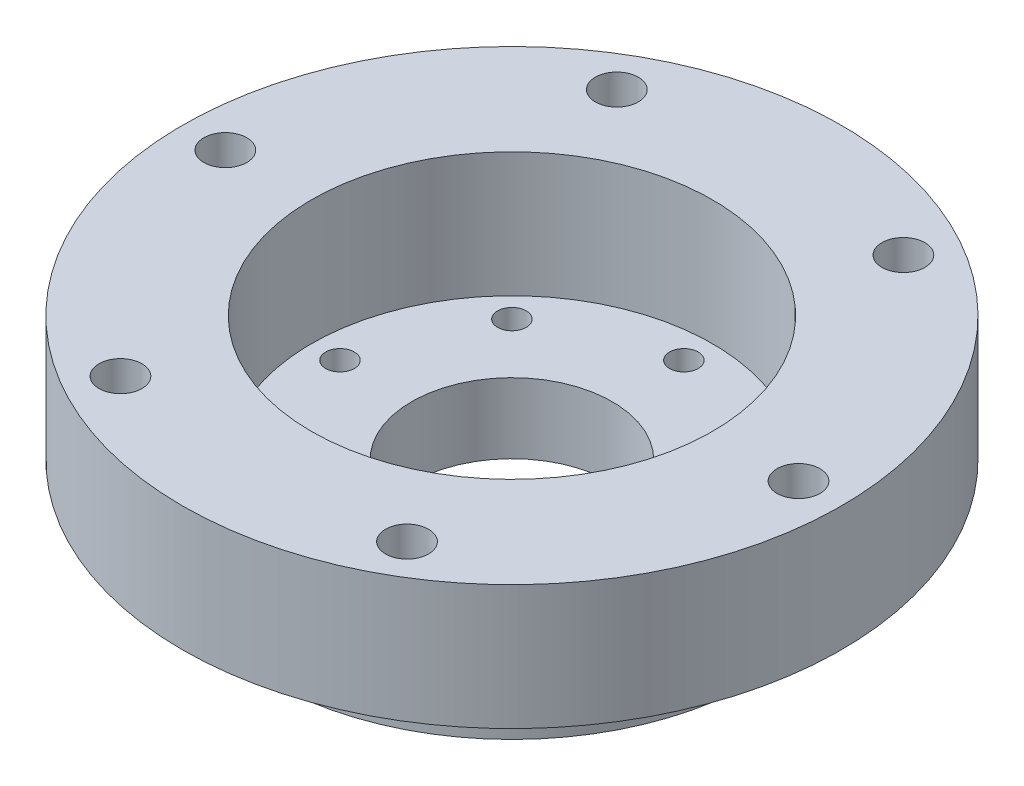
ISO-10303-21;
HEADER;
FILE_DESCRIPTION(('STEP AP214'),'2;1');
FILE_NAME('part.step','',(''),(''),'','','');
FILE_SCHEMA(('AUTOMOTIVE_DESIGN { 1 0 10303 214 1 1 1 1 }'));
ENDSEC;
DATA;
#1=APPLICATION_CONTEXT('core data for automotive mechanical design processes');
#2=APPLICATION_PROTOCOL_DEFINITION('international standard','automotive_design',2000,#1);
#3=PRODUCT_CONTEXT('',#1,'mechanical');
#4=PRODUCT('Part','Part','',(#3));
#5=PRODUCT_RELATED_PRODUCT_CATEGORY('part','',(#4));
#6=PRODUCT_DEFINITION_FORMATION('','',#4);
#7=PRODUCT_DEFINITION_CONTEXT('part definition',#1,'design');
#8=PRODUCT_DEFINITION('design','',#6,#7);
#9=PRODUCT_DEFINITION_SHAPE('','',#8);
#10=(LENGTH_UNIT() NAMED_UNIT(*) SI_UNIT(.MILLI.,.METRE.));
#11=(NAMED_UNIT(*) PLANE_ANGLE_UNIT() SI_UNIT($,.RADIAN.));
#12=(NAMED_UNIT(*) SI_UNIT($,.STERADIAN.) SOLID_ANGLE_UNIT());
#13=UNCERTAINTY_MEASURE_WITH_UNIT(LENGTH_MEASURE(1.E-05),#10,'distance_accuracy_value','');
#14=(GEOMETRIC_REPRESENTATION_CONTEXT(3) GLOBAL_UNCERTAINTY_ASSIGNED_CONTEXT((#13)) GLOBAL_UNIT_ASSIGNED_CONTEXT((#10,
#11,#12)) REPRESENTATION_CONTEXT('',''));
#15=CARTESIAN_POINT('',(0.,0.,0.));
#16=DIRECTION('',(0.,0.,1.));
#17=DIRECTION('',(1.,0.,0.));
#18=AXIS2_PLACEMENT_3D('',#15,#16,#17);
#19=CARTESIAN_POINT('',(0.,4.9,0.));
#20=DIRECTION('',(0.,1.,0.));
#21=DIRECTION('',(0.,0.,1.));
#22=AXIS2_PLACEMENT_3D('',#19,#20,#21);
#23=PLANE('',#22);
#24=CARTESIAN_POINT('',(-8.48528137423858,4.9,-8.48528137423856));
#25=DIRECTION('',(0.,1.,0.));
#26=DIRECTION('',(0.,0.,1.));
#27=AXIS2_PLACEMENT_3D('',#24,#25,#26);
#28=CIRCLE('',#27,1.);
#29=CARTESIAN_POINT('',(-8.48528137423858,4.9,-7.48528137423855));
#30=VERTEX_POINT('',#29);
#31=EDGE_CURVE('E51',#30,#30,#28,.F.);
#32=ORIENTED_EDGE('',*,*,#31,.T.);
#33=EDGE_LOOP('',(#32));
#34=FACE_BOUND('',#33,.T.);
#35=CARTESIAN_POINT('',(-8.48528137423858,4.9,8.48528137423856));
#36=DIRECTION('',(0.,1.,0.));
#37=DIRECTION('',(0.,0.,1.));
#38=AXIS2_PLACEMENT_3D('',#35,#36,#37);
#39=CIRCLE('',#38,1.);
#40=CARTESIAN_POINT('',(-8.48528137423858,4.9,9.48528137423856));
#41=VERTEX_POINT('',#40);
#42=EDGE_CURVE('E56',#41,#41,#39,.T.);
#43=ORIENTED_EDGE('',*,*,#42,.F.);
#44=EDGE_LOOP('',(#43));
#45=FACE_BOUND('',#44,.T.);
#46=CARTESIAN_POINT('',(-12.,4.9,0.));
#47=DIRECTION('',(0.,1.,0.));
#48=DIRECTION('',(0.,0.,1.));
#49=AXIS2_PLACEMENT_3D('',#46,#47,#48);
#50=CIRCLE('',#49,1.);
#51=CARTESIAN_POINT('',(-12.,4.9,1.));
#52=VERTEX_POINT('',#51);
#53=EDGE_CURVE('E62',#52,#52,#50,.F.);
#54=ORIENTED_EDGE('',*,*,#53,.T.);
#55=EDGE_LOOP('',(#54));
#56=FACE_BOUND('',#55,.T.);
#57=CARTESIAN_POINT('',(0.,4.9,0.));
#58=DIRECTION('',(0.,1.,0.));
#59=DIRECTION('',(0.,0.,1.));
#60=AXIS2_PLACEMENT_3D('',#57,#58,#59);
#61=CIRCLE('',#60,7.);
#62=CARTESIAN_POINT('',(0.,4.9,7.));
#63=VERTEX_POINT('',#62);
#64=EDGE_CURVE('E132',#63,#63,#61,.T.);
#65=ORIENTED_EDGE('',*,*,#64,.F.);
#66=EDGE_LOOP('',(#65));
#67=FACE_BOUND('',#66,.T.);
#68=CARTESIAN_POINT('',(0.,4.9,-12.));
#69=DIRECTION('',(0.,1.,0.));
#70=DIRECTION('',(0.,0.,1.));
#71=AXIS2_PLACEMENT_3D('',#68,#69,#70);
#72=CIRCLE('',#71,1.);
#73=CARTESIAN_POINT('',(0.,4.9,-11.));
#74=VERTEX_POINT('',#73);
#75=EDGE_CURVE('E128',#74,#74,#72,.T.);
#76=ORIENTED_EDGE('',*,*,#75,.F.);
#77=EDGE_LOOP('',(#76));
#78=FACE_BOUND('',#77,.T.);
#79=CARTESIAN_POINT('',(12.,4.9,0.));
#80=DIRECTION('',(0.,1.,0.));
#81=DIRECTION('',(0.,0.,1.));
#82=AXIS2_PLACEMENT_3D('',#79,#80,#81);
#83=CIRCLE('',#82,1.);
#84=CARTESIAN_POINT('',(12.,4.9,1.));
#85=VERTEX_POINT('',#84);
#86=EDGE_CURVE('E124',#85,#85,#83,.T.);
#87=ORIENTED_EDGE('',*,*,#86,.F.);
#88=EDGE_LOOP('',(#87));
#89=FACE_BOUND('',#88,.T.);
#90=CARTESIAN_POINT('',(0.,4.9,12.));
#91=DIRECTION('',(0.,1.,0.));
#92=DIRECTION('',(0.,0.,1.));
#93=AXIS2_PLACEMENT_3D('',#90,#91,#92);
#94=CIRCLE('',#93,1.);
#95=CARTESIAN_POINT('',(0.,4.9,13.));
#96=VERTEX_POINT('',#95);
#97=EDGE_CURVE('E116',#96,#96,#94,.F.);
#98=ORIENTED_EDGE('',*,*,#97,.T.);
#99=EDGE_LOOP('',(#98));
#100=FACE_BOUND('',#99,.T.);
#101=CARTESIAN_POINT('',(8.48528137423858,4.9,-8.48528137423856));
#102=DIRECTION('',(0.,1.,0.));
#103=DIRECTION('',(0.,0.,1.));
#104=AXIS2_PLACEMENT_3D('',#101,#102,#103);
#105=CIRCLE('',#104,1.);
#106=CARTESIAN_POINT('',(8.48528137423858,4.9,-7.48528137423855));
#107=VERTEX_POINT('',#106);
#108=EDGE_CURVE('E110',#107,#107,#105,.T.);
#109=ORIENTED_EDGE('',*,*,#108,.F.);
#110=EDGE_LOOP('',(#109));
#111=FACE_BOUND('',#110,.T.);
#112=CARTESIAN_POINT('',(8.48528137423858,4.9,8.48528137423856));
#113=DIRECTION('',(0.,1.,0.));
#114=DIRECTION('',(0.,0.,1.));
#115=AXIS2_PLACEMENT_3D('',#112,#113,#114);
#116=CIRCLE('',#115,1.);
#117=CARTESIAN_POINT('',(8.48528137423858,4.9,9.48528137423856));
#118=VERTEX_POINT('',#117);
#119=EDGE_CURVE('E105',#118,#118,#116,.F.);
#120=ORIENTED_EDGE('',*,*,#119,.T.);
#121=EDGE_LOOP('',(#120));
#122=FACE_BOUND('',#121,.T.);
#123=CARTESIAN_POINT('',(0.,4.9,0.));
#124=DIRECTION('',(0.,1.,0.));
#125=DIRECTION('',(0.,0.,1.));
#126=AXIS2_PLACEMENT_3D('',#123,#124,#125);
#127=CIRCLE('',#126,14.);
#128=CARTESIAN_POINT('',(0.,4.9,14.));
#129=VERTEX_POINT('',#128);
#130=EDGE_CURVE('E10',#129,#129,#127,.F.);
#131=ORIENTED_EDGE('',*,*,#130,.F.);
#132=EDGE_LOOP('',(#131));
#133=FACE_BOUND('',#132,.T.);
#134=ADVANCED_FACE('F43',(#34,#45,#56,#67,#78,#89,#100,#111,#122,#133),#23,.T.);
#135=CARTESIAN_POINT('',(-8.48528137423858,4.9,8.48528137423856));
#136=DIRECTION('',(0.,-1.,0.));
#137=DIRECTION('',(0.,0.,-1.));
#138=AXIS2_PLACEMENT_3D('',#135,#136,#137);
#139=CYLINDRICAL_SURFACE('',#138,1.);
#140=ORIENTED_EDGE('',*,*,#42,.T.);
#141=EDGE_LOOP('',(#140));
#142=FACE_BOUND('',#141,.T.);
#143=CARTESIAN_POINT('',(-8.48528137423858,0.,8.48528137423856));
#144=DIRECTION('',(0.,1.,0.));
#145=DIRECTION('',(0.,0.,1.));
#146=AXIS2_PLACEMENT_3D('',#143,#144,#145);
#147=CIRCLE('',#146,1.);
#148=CARTESIAN_POINT('',(-8.48528137423858,0.,9.48528137423856));
#149=VERTEX_POINT('',#148);
#150=EDGE_CURVE('E99',#149,#149,#147,.T.);
#151=ORIENTED_EDGE('',*,*,#150,.F.);
#152=EDGE_LOOP('',(#151));
#153=FACE_BOUND('',#152,.T.);
#154=ADVANCED_FACE('F149',(#142,#153),#139,.F.);
#155=CARTESIAN_POINT('',(-12.,4.9,0.));
#156=DIRECTION('',(0.,-1.,0.));
#157=DIRECTION('',(0.,0.,-1.));
#158=AXIS2_PLACEMENT_3D('',#155,#156,#157);
#159=CYLINDRICAL_SURFACE('',#158,1.);
#160=ORIENTED_EDGE('',*,*,#53,.F.);
#161=EDGE_LOOP('',(#160));
#162=FACE_BOUND('',#161,.T.);
#163=CARTESIAN_POINT('',(-12.,0.,0.));
#164=DIRECTION('',(0.,1.,0.));
#165=DIRECTION('',(0.,0.,1.));
#166=AXIS2_PLACEMENT_3D('',#163,#164,#165);
#167=CIRCLE('',#166,1.);
#168=CARTESIAN_POINT('',(-12.,0.,1.));
#169=VERTEX_POINT('',#168);
#170=EDGE_CURVE('E95',#169,#169,#167,.F.);
#171=ORIENTED_EDGE('',*,*,#170,.T.);
#172=EDGE_LOOP('',(#171));
#173=FACE_BOUND('',#172,.T.);
#174=ADVANCED_FACE('F145',(#162,#173),#159,.F.);
#175=CARTESIAN_POINT('',(0.,4.9,0.));
#176=DIRECTION('',(0.,-1.,0.));
#177=DIRECTION('',(0.,0.,-1.));
#178=AXIS2_PLACEMENT_3D('',#175,#176,#177);
#179=CYLINDRICAL_SURFACE('',#178,17.);
#180=CARTESIAN_POINT('',(0.,4.9,0.));
#181=DIRECTION('',(0.,1.,0.));
#182=DIRECTION('',(0.,0.,1.));
#183=AXIS2_PLACEMENT_3D('',#180,#181,#182);
#184=CIRCLE('',#183,17.);
#185=CARTESIAN_POINT('',(0.,4.9,17.));
#186=VERTEX_POINT('',#185);
#187=EDGE_CURVE('E136',#186,#186,#184,.T.);
#188=ORIENTED_EDGE('',*,*,#187,.F.);
#189=EDGE_LOOP('',(#188));
#190=FACE_BOUND('',#189,.T.);
#191=CARTESIAN_POINT('',(0.,0.,0.));
#192=DIRECTION('',(0.,1.,0.));
#193=DIRECTION('',(0.,0.,1.));
#194=AXIS2_PLACEMENT_3D('',#191,#192,#193);
#195=CIRCLE('',#194,17.);
#196=CARTESIAN_POINT('',(0.,0.,17.));
#197=VERTEX_POINT('',#196);
#198=EDGE_CURVE('E91',#197,#197,#195,.T.);
#199=ORIENTED_EDGE('',*,*,#198,.T.);
#200=EDGE_LOOP('',(#199));
#201=FACE_BOUND('',#200,.T.);
#202=ADVANCED_FACE('F148',(#190,#201),#179,.T.);
#203=CARTESIAN_POINT('',(0.,4.9,0.));
#204=DIRECTION('',(0.,-1.,0.));
#205=DIRECTION('',(0.,0.,-1.));
#206=AXIS2_PLACEMENT_3D('',#203,#204,#205);
#207=CYLINDRICAL_SURFACE('',#206,7.);
#208=ORIENTED_EDGE('',*,*,#64,.T.);
#209=EDGE_LOOP('',(#208));
#210=FACE_BOUND('',#209,.T.);
#211=CARTESIAN_POINT('',(0.,0.,0.));
#212=DIRECTION('',(0.,1.,0.));
#213=DIRECTION('',(0.,0.,1.));
#214=AXIS2_PLACEMENT_3D('',#211,#212,#213);
#215=CIRCLE('',#214,7.);
#216=CARTESIAN_POINT('',(0.,0.,7.));
#217=VERTEX_POINT('',#216);
#218=EDGE_CURVE('E87',#217,#217,#215,.T.);
#219=ORIENTED_EDGE('',*,*,#218,.F.);
#220=EDGE_LOOP('',(#219));
#221=FACE_BOUND('',#220,.T.);
#222=ADVANCED_FACE('F174',(#210,#221),#207,.F.);
#223=CARTESIAN_POINT('',(0.,4.9,-12.));
#224=DIRECTION('',(0.,-1.,0.));
#225=DIRECTION('',(0.,0.,-1.));
#226=AXIS2_PLACEMENT_3D('',#223,#224,#225);
#227=CYLINDRICAL_SURFACE('',#226,1.);
#228=ORIENTED_EDGE('',*,*,#75,.T.);
#229=EDGE_LOOP('',(#228));
#230=FACE_BOUND('',#229,.T.);
#231=CARTESIAN_POINT('',(0.,0.,-12.));
#232=DIRECTION('',(0.,1.,0.));
#233=DIRECTION('',(0.,0.,1.));
#234=AXIS2_PLACEMENT_3D('',#231,#232,#233);
#235=CIRCLE('',#234,1.);
#236=CARTESIAN_POINT('',(0.,0.,-11.));
#237=VERTEX_POINT('',#236);
#238=EDGE_CURVE('E83',#237,#237,#235,.T.);
#239=ORIENTED_EDGE('',*,*,#238,.F.);
#240=EDGE_LOOP('',(#239));
#241=FACE_BOUND('',#240,.T.);
#242=ADVANCED_FACE('F178',(#230,#241),#227,.F.);
#243=CARTESIAN_POINT('',(12.,4.9,0.));
#244=DIRECTION('',(0.,-1.,0.));
#245=DIRECTION('',(0.,0.,-1.));
#246=AXIS2_PLACEMENT_3D('',#243,#244,#245);
#247=CYLINDRICAL_SURFACE('',#246,1.);
#248=ORIENTED_EDGE('',*,*,#86,.T.);
#249=EDGE_LOOP('',(#248));
#250=FACE_BOUND('',#249,.T.);
#251=CARTESIAN_POINT('',(12.,0.,0.));
#252=DIRECTION('',(0.,1.,0.));
#253=DIRECTION('',(0.,0.,1.));
#254=AXIS2_PLACEMENT_3D('',#251,#252,#253);
#255=CIRCLE('',#254,1.);
#256=CARTESIAN_POINT('',(12.,0.,1.));
#257=VERTEX_POINT('',#256);
#258=EDGE_CURVE('E79',#257,#257,#255,.T.);
#259=ORIENTED_EDGE('',*,*,#258,.F.);
#260=EDGE_LOOP('',(#259));
#261=FACE_BOUND('',#260,.T.);
#262=ADVANCED_FACE('F182',(#250,#261),#247,.F.);
#263=CARTESIAN_POINT('',(0.,4.9,12.));
#264=DIRECTION('',(0.,-1.,0.));
#265=DIRECTION('',(0.,0.,-1.));
#266=AXIS2_PLACEMENT_3D('',#263,#264,#265);
#267=CYLINDRICAL_SURFACE('',#266,1.);
#268=ORIENTED_EDGE('',*,*,#97,.F.);
#269=EDGE_LOOP('',(#268));
#270=FACE_BOUND('',#269,.T.);
#271=CARTESIAN_POINT('',(0.,0.,12.));
#272=DIRECTION('',(0.,1.,0.));
#273=DIRECTION('',(0.,0.,1.));
#274=AXIS2_PLACEMENT_3D('',#271,#272,#273);
#275=CIRCLE('',#274,1.);
#276=CARTESIAN_POINT('',(0.,0.,13.));
#277=VERTEX_POINT('',#276);
#278=EDGE_CURVE('E75',#277,#277,#275,.F.);
#279=ORIENTED_EDGE('',*,*,#278,.T.);
#280=EDGE_LOOP('',(#279));
#281=FACE_BOUND('',#280,.T.);
#282=ADVANCED_FACE('F186',(#270,#281),#267,.F.);
#283=CARTESIAN_POINT('',(8.48528137423858,4.9,-8.48528137423856));
#284=DIRECTION('',(0.,-1.,0.));
#285=DIRECTION('',(0.,0.,-1.));
#286=AXIS2_PLACEMENT_3D('',#283,#284,#285);
#287=CYLINDRICAL_SURFACE('',#286,1.);
#288=ORIENTED_EDGE('',*,*,#108,.T.);
#289=EDGE_LOOP('',(#288));
#290=FACE_BOUND('',#289,.T.);
#291=CARTESIAN_POINT('',(8.48528137423858,0.,-8.48528137423856));
#292=DIRECTION('',(0.,1.,0.));
#293=DIRECTION('',(0.,0.,1.));
#294=AXIS2_PLACEMENT_3D('',#291,#292,#293);
#295=CIRCLE('',#294,1.);
#296=CARTESIAN_POINT('',(8.48528137423858,0.,-7.48528137423855));
#297=VERTEX_POINT('',#296);
#298=EDGE_CURVE('E70',#297,#297,#295,.T.);
#299=ORIENTED_EDGE('',*,*,#298,.F.);
#300=EDGE_LOOP('',(#299));
#301=FACE_BOUND('',#300,.T.);
#302=ADVANCED_FACE('F189',(#290,#301),#287,.F.);
#303=CARTESIAN_POINT('',(8.48528137423858,4.9,8.48528137423856));
#304=DIRECTION('',(0.,-1.,0.));
#305=DIRECTION('',(0.,0.,-1.));
#306=AXIS2_PLACEMENT_3D('',#303,#304,#305);
#307=CYLINDRICAL_SURFACE('',#306,1.);
#308=ORIENTED_EDGE('',*,*,#119,.F.);
#309=EDGE_LOOP('',(#308));
#310=FACE_BOUND('',#309,.T.);
#311=CARTESIAN_POINT('',(8.48528137423858,0.,8.48528137423856));
#312=DIRECTION('',(0.,1.,0.));
#313=DIRECTION('',(0.,0.,1.));
#314=AXIS2_PLACEMENT_3D('',#311,#312,#313);
#315=CIRCLE('',#314,1.);
#316=CARTESIAN_POINT('',(8.48528137423858,0.,9.48528137423856));
#317=VERTEX_POINT('',#316);
#318=EDGE_CURVE('E66',#317,#317,#315,.F.);
#319=ORIENTED_EDGE('',*,*,#318,.T.);
#320=EDGE_LOOP('',(#319));
#321=FACE_BOUND('',#320,.T.);
#322=ADVANCED_FACE('F45',(#310,#321),#307,.F.);
#323=CARTESIAN_POINT('',(-8.48528137423858,4.9,-8.48528137423856));
#324=DIRECTION('',(0.,-1.,0.));
#325=DIRECTION('',(0.,0.,-1.));
#326=AXIS2_PLACEMENT_3D('',#323,#324,#325);
#327=CYLINDRICAL_SURFACE('',#326,1.);
#328=ORIENTED_EDGE('',*,*,#31,.F.);
#329=EDGE_LOOP('',(#328));
#330=FACE_BOUND('',#329,.T.);
#331=CARTESIAN_POINT('',(-8.48528137423858,0.,-8.48528137423856));
#332=DIRECTION('',(0.,1.,0.));
#333=DIRECTION('',(0.,0.,1.));
#334=AXIS2_PLACEMENT_3D('',#331,#332,#333);
#335=CIRCLE('',#334,1.);
#336=CARTESIAN_POINT('',(-8.48528137423858,0.,-7.48528137423855));
#337=VERTEX_POINT('',#336);
#338=EDGE_CURVE('E102',#337,#337,#335,.F.);
#339=ORIENTED_EDGE('',*,*,#338,.T.);
#340=EDGE_LOOP('',(#339));
#341=FACE_BOUND('',#340,.T.);
#342=ADVANCED_FACE('F157',(#330,#341),#327,.F.);
#343=CARTESIAN_POINT('',(0.,0.,0.));
#344=DIRECTION('',(0.,1.,0.));
#345=DIRECTION('',(0.,0.,1.));
#346=AXIS2_PLACEMENT_3D('',#343,#344,#345);
#347=PLANE('',#346);
#348=ORIENTED_EDGE('',*,*,#318,.F.);
#349=EDGE_LOOP('',(#348));
#350=FACE_BOUND('',#349,.T.);
#351=ORIENTED_EDGE('',*,*,#298,.T.);
#352=EDGE_LOOP('',(#351));
#353=FACE_BOUND('',#352,.T.);
#354=ORIENTED_EDGE('',*,*,#278,.F.);
#355=EDGE_LOOP('',(#354));
#356=FACE_BOUND('',#355,.T.);
#357=ORIENTED_EDGE('',*,*,#258,.T.);
#358=EDGE_LOOP('',(#357));
#359=FACE_BOUND('',#358,.T.);
#360=ORIENTED_EDGE('',*,*,#238,.T.);
#361=EDGE_LOOP('',(#360));
#362=FACE_BOUND('',#361,.T.);
#363=ORIENTED_EDGE('',*,*,#218,.T.);
#364=EDGE_LOOP('',(#363));
#365=FACE_BOUND('',#364,.T.);
#366=ORIENTED_EDGE('',*,*,#198,.F.);
#367=EDGE_LOOP('',(#366));
#368=FACE_BOUND('',#367,.T.);
#369=ORIENTED_EDGE('',*,*,#170,.F.);
#370=EDGE_LOOP('',(#369));
#371=FACE_BOUND('',#370,.T.);
#372=ORIENTED_EDGE('',*,*,#150,.T.);
#373=EDGE_LOOP('',(#372));
#374=FACE_BOUND('',#373,.T.);
#375=ORIENTED_EDGE('',*,*,#338,.F.);
#376=EDGE_LOOP('',(#375));
#377=FACE_BOUND('',#376,.T.);
#378=ADVANCED_FACE('F153',(#350,#353,#356,#359,#362,#365,#368,#371,#374,#377),#347,.F.);
#379=CARTESIAN_POINT('',(10.,10.9,17.3205080756888));
#380=DIRECTION('',(0.,-1.,0.));
#381=DIRECTION('',(0.,0.,-1.));
#382=AXIS2_PLACEMENT_3D('',#379,#380,#381);
#383=CYLINDRICAL_SURFACE('',#382,1.5);
#384=CARTESIAN_POINT('',(10.,4.9,17.3205080756888));
#385=DIRECTION('',(0.,1.,0.));
#386=DIRECTION('',(0.,0.,1.));
#387=AXIS2_PLACEMENT_3D('',#384,#385,#386);
#388=CIRCLE('',#387,1.5);
#389=CARTESIAN_POINT('',(10.,4.9,18.8205080756888));
#390=VERTEX_POINT('',#389);
#391=EDGE_CURVE('E71',#390,#390,#388,.F.);
#392=ORIENTED_EDGE('',*,*,#391,.T.);
#393=EDGE_LOOP('',(#392));
#394=FACE_BOUND('',#393,.T.);
#395=CARTESIAN_POINT('',(10.,13.6,17.3205080756888));
#396=DIRECTION('',(0.,1.,0.));
#397=DIRECTION('',(0.,0.,1.));
#398=AXIS2_PLACEMENT_3D('',#395,#396,#397);
#399=CIRCLE('',#398,1.5);
#400=CARTESIAN_POINT('',(10.,13.6,18.8205080756888));
#401=VERTEX_POINT('',#400);
#402=EDGE_CURVE('E473',#401,#401,#399,.T.);
#403=ORIENTED_EDGE('',*,*,#402,.T.);
#404=EDGE_LOOP('',(#403));
#405=FACE_BOUND('',#404,.T.);
#406=ADVANCED_FACE('F156',(#394,#405),#383,.F.);
#407=CARTESIAN_POINT('',(-20.,10.9,0.));
#408=DIRECTION('',(0.,-1.,0.));
#409=DIRECTION('',(0.,0.,-1.));
#410=AXIS2_PLACEMENT_3D('',#407,#408,#409);
#411=CYLINDRICAL_SURFACE('',#410,1.5);
#412=CARTESIAN_POINT('',(-20.,4.9,0.));
#413=DIRECTION('',(0.,1.,0.));
#414=DIRECTION('',(0.,0.,1.));
#415=AXIS2_PLACEMENT_3D('',#412,#413,#414);
#416=CIRCLE('',#415,1.5);
#417=CARTESIAN_POINT('',(-20.,4.9,1.5));
#418=VERTEX_POINT('',#417);
#419=EDGE_CURVE('E530',#418,#418,#416,.F.);
#420=ORIENTED_EDGE('',*,*,#419,.T.);
#421=EDGE_LOOP('',(#420));
#422=FACE_BOUND('',#421,.T.);
#423=CARTESIAN_POINT('',(-20.,13.6,0.));
#424=DIRECTION('',(0.,1.,0.));
#425=DIRECTION('',(0.,0.,1.));
#426=AXIS2_PLACEMENT_3D('',#423,#424,#425);
#427=CIRCLE('',#426,1.5);
#428=CARTESIAN_POINT('',(-20.,13.6,1.5));
#429=VERTEX_POINT('',#428);
#430=EDGE_CURVE('E465',#429,#429,#427,.T.);
#431=ORIENTED_EDGE('',*,*,#430,.T.);
#432=EDGE_LOOP('',(#431));
#433=FACE_BOUND('',#432,.T.);
#434=ADVANCED_FACE('F237',(#422,#433),#411,.F.);
#435=CARTESIAN_POINT('',(20.,10.9,0.));
#436=DIRECTION('',(0.,-1.,0.));
#437=DIRECTION('',(0.,0.,-1.));
#438=AXIS2_PLACEMENT_3D('',#435,#436,#437);
#439=CYLINDRICAL_SURFACE('',#438,1.5);
#440=CARTESIAN_POINT('',(20.,4.9,0.));
#441=DIRECTION('',(0.,1.,0.));
#442=DIRECTION('',(0.,0.,1.));
#443=AXIS2_PLACEMENT_3D('',#440,#441,#442);
#444=CIRCLE('',#443,1.5);
#445=CARTESIAN_POINT('',(20.,4.9,1.5));
#446=VERTEX_POINT('',#445);
#447=EDGE_CURVE('E527',#446,#446,#444,.T.);
#448=ORIENTED_EDGE('',*,*,#447,.F.);
#449=EDGE_LOOP('',(#448));
#450=FACE_BOUND('',#449,.T.);
#451=CARTESIAN_POINT('',(20.,13.6,0.));
#452=DIRECTION('',(0.,1.,0.));
#453=DIRECTION('',(0.,0.,1.));
#454=AXIS2_PLACEMENT_3D('',#451,#452,#453);
#455=CIRCLE('',#454,1.5);
#456=CARTESIAN_POINT('',(20.,13.6,1.5));
#457=VERTEX_POINT('',#456);
#458=EDGE_CURVE('E485',#457,#457,#455,.T.);
#459=ORIENTED_EDGE('',*,*,#458,.T.);
#460=EDGE_LOOP('',(#459));
#461=FACE_BOUND('',#460,.T.);
#462=ADVANCED_FACE('F246',(#450,#461),#439,.F.);
#463=CARTESIAN_POINT('',(0.,10.9,0.));
#464=DIRECTION('',(0.,-1.,0.));
#465=DIRECTION('',(0.,0.,-1.));
#466=AXIS2_PLACEMENT_3D('',#463,#464,#465);
#467=CYLINDRICAL_SURFACE('',#466,23.);
#468=CARTESIAN_POINT('',(0.,4.9,0.));
#469=DIRECTION('',(0.,1.,0.));
#470=DIRECTION('',(0.,0.,1.));
#471=AXIS2_PLACEMENT_3D('',#468,#469,#470);
#472=CIRCLE('',#471,23.);
#473=CARTESIAN_POINT('',(0.,4.9,23.));
#474=VERTEX_POINT('',#473);
#475=EDGE_CURVE('E523',#474,#474,#472,.T.);
#476=ORIENTED_EDGE('',*,*,#475,.T.);
#477=EDGE_LOOP('',(#476));
#478=FACE_BOUND('',#477,.T.);
#479=CARTESIAN_POINT('',(0.,13.6,0.));
#480=DIRECTION('',(0.,1.,0.));
#481=DIRECTION('',(0.,0.,1.));
#482=AXIS2_PLACEMENT_3D('',#479,#480,#481);
#483=CIRCLE('',#482,23.);
#484=CARTESIAN_POINT('',(0.,13.6,23.));
#485=VERTEX_POINT('',#484);
#486=EDGE_CURVE('E477',#485,#485,#483,.T.);
#487=ORIENTED_EDGE('',*,*,#486,.F.);
#488=EDGE_LOOP('',(#487));
#489=FACE_BOUND('',#488,.T.);
#490=ADVANCED_FACE('F254',(#478,#489),#467,.T.);
#491=CARTESIAN_POINT('',(10.,10.9,-17.3205080756888));
#492=DIRECTION('',(0.,-1.,0.));
#493=DIRECTION('',(0.,0.,-1.));
#494=AXIS2_PLACEMENT_3D('',#491,#492,#493);
#495=CYLINDRICAL_SURFACE('',#494,1.5);
#496=CARTESIAN_POINT('',(10.,4.9,-17.3205080756888));
#497=DIRECTION('',(0.,1.,0.));
#498=DIRECTION('',(0.,0.,1.));
#499=AXIS2_PLACEMENT_3D('',#496,#497,#498);
#500=CIRCLE('',#499,1.5);
#501=CARTESIAN_POINT('',(10.,4.9,-15.8205080756888));
#502=VERTEX_POINT('',#501);
#503=EDGE_CURVE('E519',#502,#502,#500,.T.);
#504=ORIENTED_EDGE('',*,*,#503,.F.);
#505=EDGE_LOOP('',(#504));
#506=FACE_BOUND('',#505,.T.);
#507=CARTESIAN_POINT('',(10.,13.6,-17.3205080756888));
#508=DIRECTION('',(0.,1.,0.));
#509=DIRECTION('',(0.,0.,1.));
#510=AXIS2_PLACEMENT_3D('',#507,#508,#509);
#511=CIRCLE('',#510,1.5);
#512=CARTESIAN_POINT('',(10.,13.6,-15.8205080756888));
#513=VERTEX_POINT('',#512);
#514=EDGE_CURVE('E469',#513,#513,#511,.T.);
#515=ORIENTED_EDGE('',*,*,#514,.T.);
#516=EDGE_LOOP('',(#515));
#517=FACE_BOUND('',#516,.T.);
#518=ADVANCED_FACE('F262',(#506,#517),#495,.F.);
#519=CARTESIAN_POINT('',(-10.,10.9,-17.3205080756888));
#520=DIRECTION('',(0.,-1.,0.));
#521=DIRECTION('',(0.,0.,-1.));
#522=AXIS2_PLACEMENT_3D('',#519,#520,#521);
#523=CYLINDRICAL_SURFACE('',#522,1.5);
#524=CARTESIAN_POINT('',(-10.,4.9,-17.3205080756888));
#525=DIRECTION('',(0.,1.,0.));
#526=DIRECTION('',(0.,0.,1.));
#527=AXIS2_PLACEMENT_3D('',#524,#525,#526);
#528=CIRCLE('',#527,1.5);
#529=CARTESIAN_POINT('',(-10.,4.9,-15.8205080756888));
#530=VERTEX_POINT('',#529);
#531=EDGE_CURVE('E515',#530,#530,#528,.F.);
#532=ORIENTED_EDGE('',*,*,#531,.T.);
#533=EDGE_LOOP('',(#532));
#534=FACE_BOUND('',#533,.T.);
#535=CARTESIAN_POINT('',(-10.,13.6,-17.3205080756888));
#536=DIRECTION('',(0.,1.,0.));
#537=DIRECTION('',(0.,0.,1.));
#538=AXIS2_PLACEMENT_3D('',#535,#536,#537);
#539=CIRCLE('',#538,1.5);
#540=CARTESIAN_POINT('',(-10.,13.6,-15.8205080756888));
#541=VERTEX_POINT('',#540);
#542=EDGE_CURVE('E492',#541,#541,#539,.T.);
#543=ORIENTED_EDGE('',*,*,#542,.T.);
#544=EDGE_LOOP('',(#543));
#545=FACE_BOUND('',#544,.T.);
#546=ADVANCED_FACE('F270',(#534,#545),#523,.F.);
#547=CARTESIAN_POINT('',(-10.,10.9,17.3205080756888));
#548=DIRECTION('',(0.,-1.,0.));
#549=DIRECTION('',(0.,0.,-1.));
#550=AXIS2_PLACEMENT_3D('',#547,#548,#549);
#551=CYLINDRICAL_SURFACE('',#550,1.5);
#552=CARTESIAN_POINT('',(-10.,4.9,17.3205080756888));
#553=DIRECTION('',(0.,1.,0.));
#554=DIRECTION('',(0.,0.,1.));
#555=AXIS2_PLACEMENT_3D('',#552,#553,#554);
#556=CIRCLE('',#555,1.5);
#557=CARTESIAN_POINT('',(-10.,4.9,18.8205080756888));
#558=VERTEX_POINT('',#557);
#559=EDGE_CURVE('E511',#558,#558,#556,.T.);
#560=ORIENTED_EDGE('',*,*,#559,.F.);
#561=EDGE_LOOP('',(#560));
#562=FACE_BOUND('',#561,.T.);
#563=CARTESIAN_POINT('',(-10.,13.6,17.3205080756888));
#564=DIRECTION('',(0.,1.,0.));
#565=DIRECTION('',(0.,0.,1.));
#566=AXIS2_PLACEMENT_3D('',#563,#564,#565);
#567=CIRCLE('',#566,1.5);
#568=CARTESIAN_POINT('',(-10.,13.6,18.8205080756888));
#569=VERTEX_POINT('',#568);
#570=EDGE_CURVE('E489',#569,#569,#567,.T.);
#571=ORIENTED_EDGE('',*,*,#570,.T.);
#572=EDGE_LOOP('',(#571));
#573=FACE_BOUND('',#572,.T.);
#574=ADVANCED_FACE('F278',(#562,#573),#551,.F.);
#575=CARTESIAN_POINT('',(0.,10.9,0.));
#576=DIRECTION('',(0.,-1.,0.));
#577=DIRECTION('',(0.,0.,-1.));
#578=AXIS2_PLACEMENT_3D('',#575,#576,#577);
#579=CYLINDRICAL_SURFACE('',#578,14.);
#580=ORIENTED_EDGE('',*,*,#130,.T.);
#581=EDGE_LOOP('',(#580));
#582=FACE_BOUND('',#581,.T.);
#583=CARTESIAN_POINT('',(0.,13.6,0.));
#584=DIRECTION('',(0.,1.,0.));
#585=DIRECTION('',(0.,0.,1.));
#586=AXIS2_PLACEMENT_3D('',#583,#584,#585);
#587=CIRCLE('',#586,14.);
#588=CARTESIAN_POINT('',(0.,13.6,14.));
#589=VERTEX_POINT('',#588);
#590=EDGE_CURVE('E481',#589,#589,#587,.T.);
#591=ORIENTED_EDGE('',*,*,#590,.T.);
#592=EDGE_LOOP('',(#591));
#593=FACE_BOUND('',#592,.T.);
#594=ADVANCED_FACE('F286',(#582,#593),#579,.F.);
#595=CARTESIAN_POINT('',(0.,4.9,0.));
#596=DIRECTION('',(0.,1.,0.));
#597=DIRECTION('',(0.,0.,1.));
#598=AXIS2_PLACEMENT_3D('',#595,#596,#597);
#599=PLANE('',#598);
#600=ORIENTED_EDGE('',*,*,#187,.T.);
#601=EDGE_LOOP('',(#600));
#602=FACE_BOUND('',#601,.T.);
#603=ORIENTED_EDGE('',*,*,#559,.T.);
#604=EDGE_LOOP('',(#603));
#605=FACE_BOUND('',#604,.T.);
#606=ORIENTED_EDGE('',*,*,#531,.F.);
#607=EDGE_LOOP('',(#606));
#608=FACE_BOUND('',#607,.T.);
#609=ORIENTED_EDGE('',*,*,#503,.T.);
#610=EDGE_LOOP('',(#609));
#611=FACE_BOUND('',#610,.T.);
#612=ORIENTED_EDGE('',*,*,#475,.F.);
#613=EDGE_LOOP('',(#612));
#614=FACE_BOUND('',#613,.T.);
#615=ORIENTED_EDGE('',*,*,#447,.T.);
#616=EDGE_LOOP('',(#615));
#617=FACE_BOUND('',#616,.T.);
#618=ORIENTED_EDGE('',*,*,#419,.F.);
#619=EDGE_LOOP('',(#618));
#620=FACE_BOUND('',#619,.T.);
#621=ORIENTED_EDGE('',*,*,#391,.F.);
#622=EDGE_LOOP('',(#621));
#623=FACE_BOUND('',#622,.T.);
#624=ADVANCED_FACE('F294',(#602,#605,#608,#611,#614,#617,#620,#623),#599,.F.);
#625=CARTESIAN_POINT('',(0.,13.6,0.));
#626=DIRECTION('',(0.,1.,0.));
#627=DIRECTION('',(0.,0.,1.));
#628=AXIS2_PLACEMENT_3D('',#625,#626,#627);
#629=PLANE('',#628);
#630=ORIENTED_EDGE('',*,*,#430,.F.);
#631=EDGE_LOOP('',(#630));
#632=FACE_BOUND('',#631,.T.);
#633=ORIENTED_EDGE('',*,*,#514,.F.);
#634=EDGE_LOOP('',(#633));
#635=FACE_BOUND('',#634,.T.);
#636=ORIENTED_EDGE('',*,*,#402,.F.);
#637=EDGE_LOOP('',(#636));
#638=FACE_BOUND('',#637,.T.);
#639=ORIENTED_EDGE('',*,*,#486,.T.);
#640=EDGE_LOOP('',(#639));
#641=FACE_BOUND('',#640,.T.);
#642=ORIENTED_EDGE('',*,*,#590,.F.);
#643=EDGE_LOOP('',(#642));
#644=FACE_BOUND('',#643,.T.);
#645=ORIENTED_EDGE('',*,*,#458,.F.);
#646=EDGE_LOOP('',(#645));
#647=FACE_BOUND('',#646,.T.);
#648=ORIENTED_EDGE('',*,*,#570,.F.);
#649=EDGE_LOOP('',(#648));
#650=FACE_BOUND('',#649,.T.);
#651=ORIENTED_EDGE('',*,*,#542,.F.);
#652=EDGE_LOOP('',(#651));
#653=FACE_BOUND('',#652,.T.);
#654=ADVANCED_FACE('F301',(#632,#635,#638,#641,#644,#647,#650,#653),#629,.T.);
#655=CLOSED_SHELL('',(#134,#154,#174,#202,#222,#242,#262,#282,#302,#322,#342,#378,#406,#434,
#462,#490,#518,#546,#574,#594,#624,#654));
#656=MANIFOLD_SOLID_BREP('B2',#655);
#657=ADVANCED_BREP_SHAPE_REPRESENTATION('',(#18,#656),#14);
#658=SHAPE_DEFINITION_REPRESENTATION(#9,#657);
ENDSEC;
END-ISO-10303-21;
